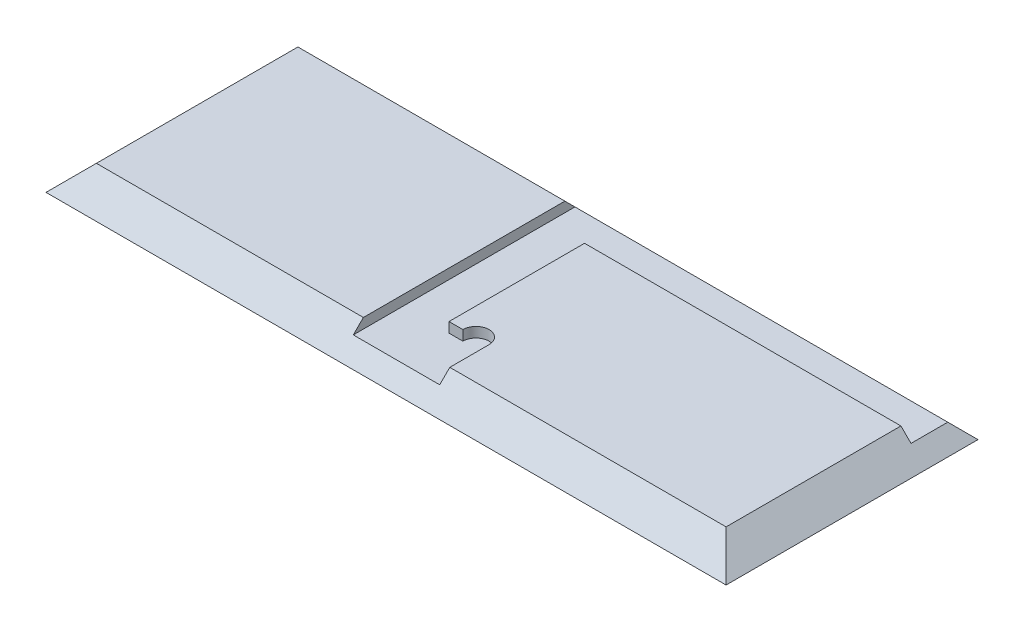
ISO-10303-21;
HEADER;
FILE_DESCRIPTION(('STEP AP214'),'2;1');
FILE_NAME('part.step','',(''),(''),'','','');
FILE_SCHEMA(('AUTOMOTIVE_DESIGN { 1 0 10303 214 1 1 1 1 }'));
ENDSEC;
DATA;
#1=APPLICATION_CONTEXT('core data for automotive mechanical design processes');
#2=APPLICATION_PROTOCOL_DEFINITION('international standard','automotive_design',2000,#1);
#3=PRODUCT_CONTEXT('',#1,'mechanical');
#4=PRODUCT('Part','Part','',(#3));
#5=PRODUCT_RELATED_PRODUCT_CATEGORY('part','',(#4));
#6=PRODUCT_DEFINITION_FORMATION('','',#4);
#7=PRODUCT_DEFINITION_CONTEXT('part definition',#1,'design');
#8=PRODUCT_DEFINITION('design','',#6,#7);
#9=PRODUCT_DEFINITION_SHAPE('','',#8);
#10=(LENGTH_UNIT() NAMED_UNIT(*) SI_UNIT(.MILLI.,.METRE.));
#11=(NAMED_UNIT(*) PLANE_ANGLE_UNIT() SI_UNIT($,.RADIAN.));
#12=(NAMED_UNIT(*) SI_UNIT($,.STERADIAN.) SOLID_ANGLE_UNIT());
#13=UNCERTAINTY_MEASURE_WITH_UNIT(LENGTH_MEASURE(1.E-05),#10,'distance_accuracy_value','');
#14=(GEOMETRIC_REPRESENTATION_CONTEXT(3) GLOBAL_UNCERTAINTY_ASSIGNED_CONTEXT((#13)) GLOBAL_UNIT_ASSIGNED_CONTEXT((#10,
#11,#12)) REPRESENTATION_CONTEXT('',''));
#15=CARTESIAN_POINT('',(0.,0.,0.));
#16=DIRECTION('',(0.,0.,1.));
#17=DIRECTION('',(1.,0.,0.));
#18=AXIS2_PLACEMENT_3D('',#15,#16,#17);
#19=CARTESIAN_POINT('',(0.,12.7,0.));
#20=DIRECTION('',(0.,1.,0.));
#21=DIRECTION('',(0.,0.,1.));
#22=AXIS2_PLACEMENT_3D('',#19,#20,#21);
#23=PLANE('',#22);
#24=DIRECTION('',(0.,0.,1.));
#25=VECTOR('',#24,1.);
#26=CARTESIAN_POINT('',(-24.1300000000015,12.7,-63.5000000000014));
#27=LINE('',#26,#25);
#28=CARTESIAN_POINT('',(-24.1300000000015,12.7,-50.8000000000014));
#29=VERTEX_POINT('',#28);
#30=CARTESIAN_POINT('',(-24.1300000000014,12.7,50.8000000000013));
#31=VERTEX_POINT('',#30);
#32=EDGE_CURVE('E177',#29,#31,#27,.T.);
#33=ORIENTED_EDGE('',*,*,#32,.F.);
#34=DIRECTION('',(1.,0.,0.));
#35=VECTOR('',#34,1.);
#36=CARTESIAN_POINT('',(-171.450000000001,12.7,-50.8000000000014));
#37=LINE('',#36,#35);
#38=CARTESIAN_POINT('',(-158.750000000001,12.7,-50.8000000000014));
#39=VERTEX_POINT('',#38);
#40=EDGE_CURVE('E63',#29,#39,#37,.F.);
#41=ORIENTED_EDGE('',*,*,#40,.T.);
#42=DIRECTION('',(0.,0.,-1.));
#43=VECTOR('',#42,1.);
#44=CARTESIAN_POINT('',(-158.750000000001,12.7,-63.5000000000014));
#45=LINE('',#44,#43);
#46=CARTESIAN_POINT('',(-158.750000000001,12.7,50.8000000000013));
#47=VERTEX_POINT('',#46);
#48=EDGE_CURVE('E209',#39,#47,#45,.F.);
#49=ORIENTED_EDGE('',*,*,#48,.T.);
#50=DIRECTION('',(-1.,0.,0.));
#51=VECTOR('',#50,1.);
#52=CARTESIAN_POINT('',(-171.450000000001,12.7,50.8000000000013));
#53=LINE('',#52,#51);
#54=EDGE_CURVE('E76',#47,#31,#53,.F.);
#55=ORIENTED_EDGE('',*,*,#54,.T.);
#56=EDGE_LOOP('',(#33,#41,#49,#55));
#57=FACE_BOUND('',#56,.T.);
#58=ADVANCED_FACE('F39',(#57),#23,.T.);
#59=CARTESIAN_POINT('',(-171.450000000001,0.,-63.5000000000014));
#60=DIRECTION('',(-0.707106781186546,0.707106781186549,0.));
#61=DIRECTION('',(-0.707106781186549,-0.707106781186546,0.));
#62=AXIS2_PLACEMENT_3D('',#59,#60,#61);
#63=PLANE('',#62);
#64=DIRECTION('',(0.,0.,1.));
#65=VECTOR('',#64,1.);
#66=CARTESIAN_POINT('',(-171.450000000001,0.,-63.5000000000014));
#67=LINE('',#66,#65);
#68=CARTESIAN_POINT('',(-171.450000000001,0.,-63.5000000000014));
#69=VERTEX_POINT('',#68);
#70=CARTESIAN_POINT('',(-171.450000000001,0.,63.5000000000014));
#71=VERTEX_POINT('',#70);
#72=EDGE_CURVE('E201',#69,#71,#67,.T.);
#73=ORIENTED_EDGE('',*,*,#72,.T.);
#74=DIRECTION('',(-0.577350269189626,-0.577350269189624,0.577350269189627));
#75=VECTOR('',#74,1.);
#76=CARTESIAN_POINT('',(-171.450000000001,0.,63.5000000000014));
#77=LINE('',#76,#75);
#78=EDGE_CURVE('E214',#47,#71,#77,.T.);
#79=ORIENTED_EDGE('',*,*,#78,.F.);
#80=ORIENTED_EDGE('',*,*,#48,.F.);
#81=DIRECTION('',(-0.577350269189627,-0.577350269189624,-0.577350269189627));
#82=VECTOR('',#81,1.);
#83=CARTESIAN_POINT('',(-171.450000000001,0.,-63.5000000000014));
#84=LINE('',#83,#82);
#85=EDGE_CURVE('E210',#39,#69,#84,.T.);
#86=ORIENTED_EDGE('',*,*,#85,.T.);
#87=EDGE_LOOP('',(#73,#79,#80,#86));
#88=FACE_BOUND('',#87,.T.);
#89=ADVANCED_FACE('F235',(#88),#63,.T.);
#90=CARTESIAN_POINT('',(-171.450000000001,0.,63.5000000000014));
#91=DIRECTION('',(0.,0.707106781186549,0.707106781186546));
#92=DIRECTION('',(0.,-0.707106781186546,0.707106781186549));
#93=AXIS2_PLACEMENT_3D('',#90,#91,#92);
#94=PLANE('',#93);
#95=DIRECTION('',(1.,0.,0.));
#96=VECTOR('',#95,1.);
#97=CARTESIAN_POINT('',(-171.450000000001,7.62,55.8800000000013));
#98=LINE('',#97,#96);
#99=CARTESIAN_POINT('',(19.4309999999999,7.62,55.8800000000013));
#100=VERTEX_POINT('',#99);
#101=CARTESIAN_POINT('',(-24.1300000000014,7.62,55.8800000000013));
#102=VERTEX_POINT('',#101);
#103=EDGE_CURVE('E47',#100,#102,#98,.F.);
#104=ORIENTED_EDGE('',*,*,#103,.T.);
#105=DIRECTION('',(0.,-0.707106781186546,0.707106781186549));
#106=VECTOR('',#105,1.);
#107=CARTESIAN_POINT('',(-24.1300000000015,0.,63.5000000000014));
#108=LINE('',#107,#106);
#109=EDGE_CURVE('E182',#102,#31,#108,.F.);
#110=ORIENTED_EDGE('',*,*,#109,.T.);
#111=ORIENTED_EDGE('',*,*,#54,.F.);
#112=ORIENTED_EDGE('',*,*,#78,.T.);
#113=DIRECTION('',(1.,0.,0.));
#114=VECTOR('',#113,1.);
#115=CARTESIAN_POINT('',(-171.450000000001,0.,63.5000000000014));
#116=LINE('',#115,#114);
#117=CARTESIAN_POINT('',(171.450000000001,0.,63.5000000000014));
#118=VERTEX_POINT('',#117);
#119=EDGE_CURVE('E204',#71,#118,#116,.T.);
#120=ORIENTED_EDGE('',*,*,#119,.T.);
#121=DIRECTION('',(0.577350269189627,-0.577350269189624,0.577350269189627));
#122=VECTOR('',#121,1.);
#123=CARTESIAN_POINT('',(129.116666666667,42.3333333333342,21.166666666667));
#124=LINE('',#123,#122);
#125=CARTESIAN_POINT('',(158.750000000001,12.7,50.8000000000013));
#126=VERTEX_POINT('',#125);
#127=EDGE_CURVE('E213',#126,#118,#124,.T.);
#128=ORIENTED_EDGE('',*,*,#127,.F.);
#129=CARTESIAN_POINT('',(19.4309999999999,12.7,50.8000000000013));
#130=VERTEX_POINT('',#129);
#131=EDGE_CURVE('E222',#130,#126,#53,.F.);
#132=ORIENTED_EDGE('',*,*,#131,.F.);
#133=DIRECTION('',(0.,0.707106781186546,-0.707106781186549));
#134=VECTOR('',#133,1.);
#135=CARTESIAN_POINT('',(19.4309999999999,0.,63.5000000000014));
#136=LINE('',#135,#134);
#137=EDGE_CURVE('E54',#130,#100,#136,.F.);
#138=ORIENTED_EDGE('',*,*,#137,.T.);
#139=EDGE_LOOP('',(#104,#110,#111,#112,#120,#128,#132,#138));
#140=FACE_BOUND('',#139,.T.);
#141=ADVANCED_FACE('F41',(#140),#94,.T.);
#142=CARTESIAN_POINT('',(171.450000000001,0.,-63.5000000000014));
#143=DIRECTION('',(0.707106781186546,0.707106781186549,0.));
#144=DIRECTION('',(-0.707106781186549,0.707106781186546,0.));
#145=AXIS2_PLACEMENT_3D('',#142,#143,#144);
#146=PLANE('',#145);
#147=DIRECTION('',(0.,0.,-1.));
#148=VECTOR('',#147,1.);
#149=CARTESIAN_POINT('',(163.830000000001,7.62,-63.5000000000014));
#150=LINE('',#149,#148);
#151=CARTESIAN_POINT('',(163.830000000001,7.62,-55.8800000000014));
#152=VERTEX_POINT('',#151);
#153=CARTESIAN_POINT('',(163.830000000001,7.62,-37.3380000000014));
#154=VERTEX_POINT('',#153);
#155=EDGE_CURVE('E161',#152,#154,#150,.F.);
#156=ORIENTED_EDGE('',*,*,#155,.T.);
#157=DIRECTION('',(0.707106781186549,-0.707106781186546,0.));
#158=VECTOR('',#157,1.);
#159=CARTESIAN_POINT('',(171.450000000001,0.,-37.3380000000014));
#160=LINE('',#159,#158);
#161=CARTESIAN_POINT('',(158.750000000001,12.7,-37.3380000000014));
#162=VERTEX_POINT('',#161);
#163=EDGE_CURVE('E148',#154,#162,#160,.F.);
#164=ORIENTED_EDGE('',*,*,#163,.T.);
#165=DIRECTION('',(0.,0.,1.));
#166=VECTOR('',#165,1.);
#167=CARTESIAN_POINT('',(158.750000000001,12.7,-63.5000000000014));
#168=LINE('',#167,#166);
#169=EDGE_CURVE('E220',#126,#162,#168,.F.);
#170=ORIENTED_EDGE('',*,*,#169,.F.);
#171=ORIENTED_EDGE('',*,*,#127,.T.);
#172=DIRECTION('',(0.,0.,-1.));
#173=VECTOR('',#172,1.);
#174=CARTESIAN_POINT('',(171.450000000001,0.,-63.5000000000014));
#175=LINE('',#174,#173);
#176=CARTESIAN_POINT('',(171.450000000001,0.,-63.5000000000014));
#177=VERTEX_POINT('',#176);
#178=EDGE_CURVE('E206',#118,#177,#175,.T.);
#179=ORIENTED_EDGE('',*,*,#178,.T.);
#180=DIRECTION('',(0.577350269189627,-0.577350269189624,-0.577350269189627));
#181=VECTOR('',#180,1.);
#182=CARTESIAN_POINT('',(57.1500000000002,114.300000000001,50.7999999999998));
#183=LINE('',#182,#181);
#184=EDGE_CURVE('E87',#152,#177,#183,.T.);
#185=ORIENTED_EDGE('',*,*,#184,.F.);
#186=EDGE_LOOP('',(#156,#164,#170,#171,#179,#185));
#187=FACE_BOUND('',#186,.T.);
#188=ADVANCED_FACE('F242',(#187),#146,.T.);
#189=CARTESIAN_POINT('',(-171.450000000001,0.,-63.5000000000014));
#190=DIRECTION('',(0.,0.707106781186549,-0.707106781186546));
#191=DIRECTION('',(0.,0.707106781186546,0.707106781186549));
#192=AXIS2_PLACEMENT_3D('',#189,#190,#191);
#193=PLANE('',#192);
#194=DIRECTION('',(1.,0.,0.));
#195=VECTOR('',#194,1.);
#196=CARTESIAN_POINT('',(-171.450000000001,7.62,-55.8800000000014));
#197=LINE('',#196,#195);
#198=CARTESIAN_POINT('',(-24.1300000000015,7.62,-55.8800000000014));
#199=VERTEX_POINT('',#198);
#200=EDGE_CURVE('E168',#152,#199,#197,.F.);
#201=ORIENTED_EDGE('',*,*,#200,.F.);
#202=ORIENTED_EDGE('',*,*,#184,.T.);
#203=DIRECTION('',(-1.,0.,0.));
#204=VECTOR('',#203,1.);
#205=CARTESIAN_POINT('',(-171.450000000001,0.,-63.5000000000014));
#206=LINE('',#205,#204);
#207=EDGE_CURVE('E82',#177,#69,#206,.T.);
#208=ORIENTED_EDGE('',*,*,#207,.T.);
#209=ORIENTED_EDGE('',*,*,#85,.F.);
#210=ORIENTED_EDGE('',*,*,#40,.F.);
#211=DIRECTION('',(0.,0.707106781186546,0.707106781186549));
#212=VECTOR('',#211,1.);
#213=CARTESIAN_POINT('',(-24.1300000000015,0.,-63.5000000000014));
#214=LINE('',#213,#212);
#215=EDGE_CURVE('E171',#29,#199,#214,.F.);
#216=ORIENTED_EDGE('',*,*,#215,.T.);
#217=EDGE_LOOP('',(#201,#202,#208,#209,#210,#216));
#218=FACE_BOUND('',#217,.T.);
#219=ADVANCED_FACE('F231',(#218),#193,.T.);
#220=DIRECTION('',(1.,0.,0.));
#221=VECTOR('',#220,1.);
#222=CARTESIAN_POINT('',(171.450000000001,12.7,-37.3380000000014));
#223=LINE('',#222,#221);
#224=CARTESIAN_POINT('',(-0.762000000001435,12.7,-37.3380000000013));
#225=VERTEX_POINT('',#224);
#226=EDGE_CURVE('E153',#225,#162,#223,.T.);
#227=ORIENTED_EDGE('',*,*,#226,.F.);
#228=DIRECTION('',(0.,0.,-1.));
#229=VECTOR('',#228,1.);
#230=CARTESIAN_POINT('',(-0.762000000001456,12.7,-63.5000000000014));
#231=LINE('',#230,#229);
#232=CARTESIAN_POINT('',(-0.762000000001435,12.7,30.9879999999996));
#233=VERTEX_POINT('',#232);
#234=EDGE_CURVE('E160',#233,#225,#231,.T.);
#235=ORIENTED_EDGE('',*,*,#234,.F.);
#236=DIRECTION('',(-1.,0.,0.));
#237=VECTOR('',#236,1.);
#238=CARTESIAN_POINT('',(-6.22299999999996,12.7,30.9879999999996));
#239=LINE('',#238,#237);
#240=CARTESIAN_POINT('',(6.22299999999996,12.7,30.9879999999996));
#241=VERTEX_POINT('',#240);
#242=EDGE_CURVE('E188',#241,#233,#239,.T.);
#243=ORIENTED_EDGE('',*,*,#242,.F.);
#244=CARTESIAN_POINT('',(12.827,12.7,30.9879999999996));
#245=DIRECTION('',(0.,1.,0.));
#246=DIRECTION('',(0.,0.,1.));
#247=AXIS2_PLACEMENT_3D('',#244,#245,#246);
#248=CIRCLE('',#247,6.604);
#249=CARTESIAN_POINT('',(19.431,12.7,30.9879999999996));
#250=VERTEX_POINT('',#249);
#251=EDGE_CURVE('E184',#250,#241,#248,.T.);
#252=ORIENTED_EDGE('',*,*,#251,.F.);
#253=DIRECTION('',(0.,0.,-1.));
#254=VECTOR('',#253,1.);
#255=CARTESIAN_POINT('',(19.431,12.7,0.));
#256=LINE('',#255,#254);
#257=EDGE_CURVE('E216',#130,#250,#256,.T.);
#258=ORIENTED_EDGE('',*,*,#257,.F.);
#259=ORIENTED_EDGE('',*,*,#131,.T.);
#260=ORIENTED_EDGE('',*,*,#169,.T.);
#261=EDGE_LOOP('',(#227,#235,#243,#252,#258,#259,#260));
#262=FACE_BOUND('',#261,.T.);
#263=ADVANCED_FACE('F245',(#262),#23,.T.);
#264=CARTESIAN_POINT('',(0.,0.,0.));
#265=DIRECTION('',(0.,1.,0.));
#266=DIRECTION('',(0.,0.,1.));
#267=AXIS2_PLACEMENT_3D('',#264,#265,#266);
#268=PLANE('',#267);
#269=ORIENTED_EDGE('',*,*,#72,.F.);
#270=ORIENTED_EDGE('',*,*,#207,.F.);
#271=ORIENTED_EDGE('',*,*,#178,.F.);
#272=ORIENTED_EDGE('',*,*,#119,.F.);
#273=EDGE_LOOP('',(#269,#270,#271,#272));
#274=FACE_BOUND('',#273,.T.);
#275=ADVANCED_FACE('F243',(#274),#268,.F.);
#276=CARTESIAN_POINT('',(-12.827,7.62,30.9879999999996));
#277=DIRECTION('',(0.,-1.,0.));
#278=DIRECTION('',(0.,0.,-1.));
#279=AXIS2_PLACEMENT_3D('',#276,#277,#278);
#280=PLANE('',#279);
#281=DIRECTION('',(-1.,0.,0.));
#282=VECTOR('',#281,1.);
#283=CARTESIAN_POINT('',(-6.22299999999996,7.62,30.9879999999996));
#284=LINE('',#283,#282);
#285=CARTESIAN_POINT('',(6.22299999999996,7.62,30.9879999999996));
#286=VERTEX_POINT('',#285);
#287=CARTESIAN_POINT('',(-0.762000000001435,7.62,30.9879999999996));
#288=VERTEX_POINT('',#287);
#289=EDGE_CURVE('E167',#286,#288,#284,.T.);
#290=ORIENTED_EDGE('',*,*,#289,.T.);
#291=DIRECTION('',(0.,0.,-1.));
#292=VECTOR('',#291,1.);
#293=CARTESIAN_POINT('',(-0.762000000001456,7.62,-63.5000000000014));
#294=LINE('',#293,#292);
#295=CARTESIAN_POINT('',(-0.762000000001435,7.62,-37.3380000000013));
#296=VERTEX_POINT('',#295);
#297=EDGE_CURVE('E158',#288,#296,#294,.T.);
#298=ORIENTED_EDGE('',*,*,#297,.T.);
#299=DIRECTION('',(1.,0.,0.));
#300=VECTOR('',#299,1.);
#301=CARTESIAN_POINT('',(171.450000000001,7.62,-37.3380000000014));
#302=LINE('',#301,#300);
#303=EDGE_CURVE('E142',#296,#154,#302,.T.);
#304=ORIENTED_EDGE('',*,*,#303,.T.);
#305=ORIENTED_EDGE('',*,*,#155,.F.);
#306=ORIENTED_EDGE('',*,*,#200,.T.);
#307=DIRECTION('',(0.,0.,1.));
#308=VECTOR('',#307,1.);
#309=CARTESIAN_POINT('',(-24.1300000000015,7.62,-63.5000000000014));
#310=LINE('',#309,#308);
#311=EDGE_CURVE('E169',#199,#102,#310,.T.);
#312=ORIENTED_EDGE('',*,*,#311,.T.);
#313=ORIENTED_EDGE('',*,*,#103,.F.);
#314=DIRECTION('',(0.,0.,-1.));
#315=VECTOR('',#314,1.);
#316=CARTESIAN_POINT('',(19.4309999999999,7.62,63.5000000000014));
#317=LINE('',#316,#315);
#318=CARTESIAN_POINT('',(19.431,7.62,30.9879999999996));
#319=VERTEX_POINT('',#318);
#320=EDGE_CURVE('E185',#100,#319,#317,.T.);
#321=ORIENTED_EDGE('',*,*,#320,.T.);
#322=CARTESIAN_POINT('',(12.827,7.62,30.9879999999996));
#323=DIRECTION('',(0.,1.,0.));
#324=DIRECTION('',(0.,0.,1.));
#325=AXIS2_PLACEMENT_3D('',#322,#323,#324);
#326=CIRCLE('',#325,6.604);
#327=EDGE_CURVE('E187',#319,#286,#326,.T.);
#328=ORIENTED_EDGE('',*,*,#327,.T.);
#329=EDGE_LOOP('',(#290,#298,#304,#305,#306,#312,#313,#321,#328));
#330=FACE_BOUND('',#329,.T.);
#331=ADVANCED_FACE('F164',(#330),#280,.F.);
#332=CARTESIAN_POINT('',(19.4309999999999,7.62,63.5000000000014));
#333=DIRECTION('',(1.,0.,0.));
#334=DIRECTION('',(0.,0.,-1.));
#335=AXIS2_PLACEMENT_3D('',#332,#333,#334);
#336=PLANE('',#335);
#337=ORIENTED_EDGE('',*,*,#257,.T.);
#338=DIRECTION('',(0.,1.,0.));
#339=VECTOR('',#338,1.);
#340=CARTESIAN_POINT('',(19.431,7.62,30.9879999999996));
#341=LINE('',#340,#339);
#342=EDGE_CURVE('E191',#319,#250,#341,.T.);
#343=ORIENTED_EDGE('',*,*,#342,.F.);
#344=ORIENTED_EDGE('',*,*,#320,.F.);
#345=ORIENTED_EDGE('',*,*,#137,.F.);
#346=EDGE_LOOP('',(#337,#343,#344,#345));
#347=FACE_BOUND('',#346,.T.);
#348=ADVANCED_FACE('F251',(#347),#336,.F.);
#349=CARTESIAN_POINT('',(-6.22299999999996,7.62,30.9879999999996));
#350=DIRECTION('',(0.,0.,-1.));
#351=DIRECTION('',(-1.,0.,0.));
#352=AXIS2_PLACEMENT_3D('',#349,#350,#351);
#353=PLANE('',#352);
#354=ORIENTED_EDGE('',*,*,#242,.T.);
#355=DIRECTION('',(0.,-1.,0.));
#356=VECTOR('',#355,1.);
#357=CARTESIAN_POINT('',(-0.762000000001435,7.62,30.9879999999996));
#358=LINE('',#357,#356);
#359=EDGE_CURVE('E11',#233,#288,#358,.T.);
#360=ORIENTED_EDGE('',*,*,#359,.T.);
#361=ORIENTED_EDGE('',*,*,#289,.F.);
#362=DIRECTION('',(0.,1.,0.));
#363=VECTOR('',#362,1.);
#364=CARTESIAN_POINT('',(6.22299999999996,7.62,30.9879999999996));
#365=LINE('',#364,#363);
#366=EDGE_CURVE('E196',#286,#241,#365,.T.);
#367=ORIENTED_EDGE('',*,*,#366,.T.);
#368=EDGE_LOOP('',(#354,#360,#361,#367));
#369=FACE_BOUND('',#368,.T.);
#370=ADVANCED_FACE('F266',(#369),#353,.F.);
#371=CARTESIAN_POINT('',(12.827,7.62,30.9879999999996));
#372=DIRECTION('',(0.,1.,0.));
#373=DIRECTION('',(0.,0.,1.));
#374=AXIS2_PLACEMENT_3D('',#371,#372,#373);
#375=CYLINDRICAL_SURFACE('',#374,6.604);
#376=ORIENTED_EDGE('',*,*,#251,.T.);
#377=ORIENTED_EDGE('',*,*,#366,.F.);
#378=ORIENTED_EDGE('',*,*,#327,.F.);
#379=ORIENTED_EDGE('',*,*,#342,.T.);
#380=EDGE_LOOP('',(#376,#377,#378,#379));
#381=FACE_BOUND('',#380,.T.);
#382=ADVANCED_FACE('F267',(#381),#375,.F.);
#383=CARTESIAN_POINT('',(-24.1300000000015,7.62,-63.5000000000014));
#384=DIRECTION('',(-1.,0.,0.));
#385=DIRECTION('',(0.,0.,1.));
#386=AXIS2_PLACEMENT_3D('',#383,#384,#385);
#387=PLANE('',#386);
#388=ORIENTED_EDGE('',*,*,#311,.F.);
#389=ORIENTED_EDGE('',*,*,#215,.F.);
#390=ORIENTED_EDGE('',*,*,#32,.T.);
#391=ORIENTED_EDGE('',*,*,#109,.F.);
#392=EDGE_LOOP('',(#388,#389,#390,#391));
#393=FACE_BOUND('',#392,.T.);
#394=ADVANCED_FACE('F230',(#393),#387,.F.);
#395=CARTESIAN_POINT('',(-0.762000000001456,7.62,-63.5000000000014));
#396=DIRECTION('',(1.,0.,0.));
#397=DIRECTION('',(0.,0.,-1.));
#398=AXIS2_PLACEMENT_3D('',#395,#396,#397);
#399=PLANE('',#398);
#400=ORIENTED_EDGE('',*,*,#234,.T.);
#401=DIRECTION('',(0.,1.,0.));
#402=VECTOR('',#401,1.);
#403=CARTESIAN_POINT('',(-0.762000000001435,7.62,-37.3380000000013));
#404=LINE('',#403,#402);
#405=EDGE_CURVE('E145',#296,#225,#404,.T.);
#406=ORIENTED_EDGE('',*,*,#405,.F.);
#407=ORIENTED_EDGE('',*,*,#297,.F.);
#408=ORIENTED_EDGE('',*,*,#359,.F.);
#409=EDGE_LOOP('',(#400,#406,#407,#408));
#410=FACE_BOUND('',#409,.T.);
#411=ADVANCED_FACE('F157',(#410),#399,.F.);
#412=CARTESIAN_POINT('',(171.450000000001,7.62,-37.3380000000014));
#413=DIRECTION('',(0.,0.,1.));
#414=DIRECTION('',(1.,0.,0.));
#415=AXIS2_PLACEMENT_3D('',#412,#413,#414);
#416=PLANE('',#415);
#417=ORIENTED_EDGE('',*,*,#303,.F.);
#418=ORIENTED_EDGE('',*,*,#405,.T.);
#419=ORIENTED_EDGE('',*,*,#226,.T.);
#420=ORIENTED_EDGE('',*,*,#163,.F.);
#421=EDGE_LOOP('',(#417,#418,#419,#420));
#422=FACE_BOUND('',#421,.T.);
#423=ADVANCED_FACE('F144',(#422),#416,.F.);
#424=CLOSED_SHELL('',(#58,#89,#141,#188,#219,#263,#275,#331,#348,#370,#382,#394,#411,#423));
#425=MANIFOLD_SOLID_BREP('B2',#424);
#426=ADVANCED_BREP_SHAPE_REPRESENTATION('',(#18,#425),#14);
#427=SHAPE_DEFINITION_REPRESENTATION(#9,#426);
ENDSEC;
END-ISO-10303-21;
